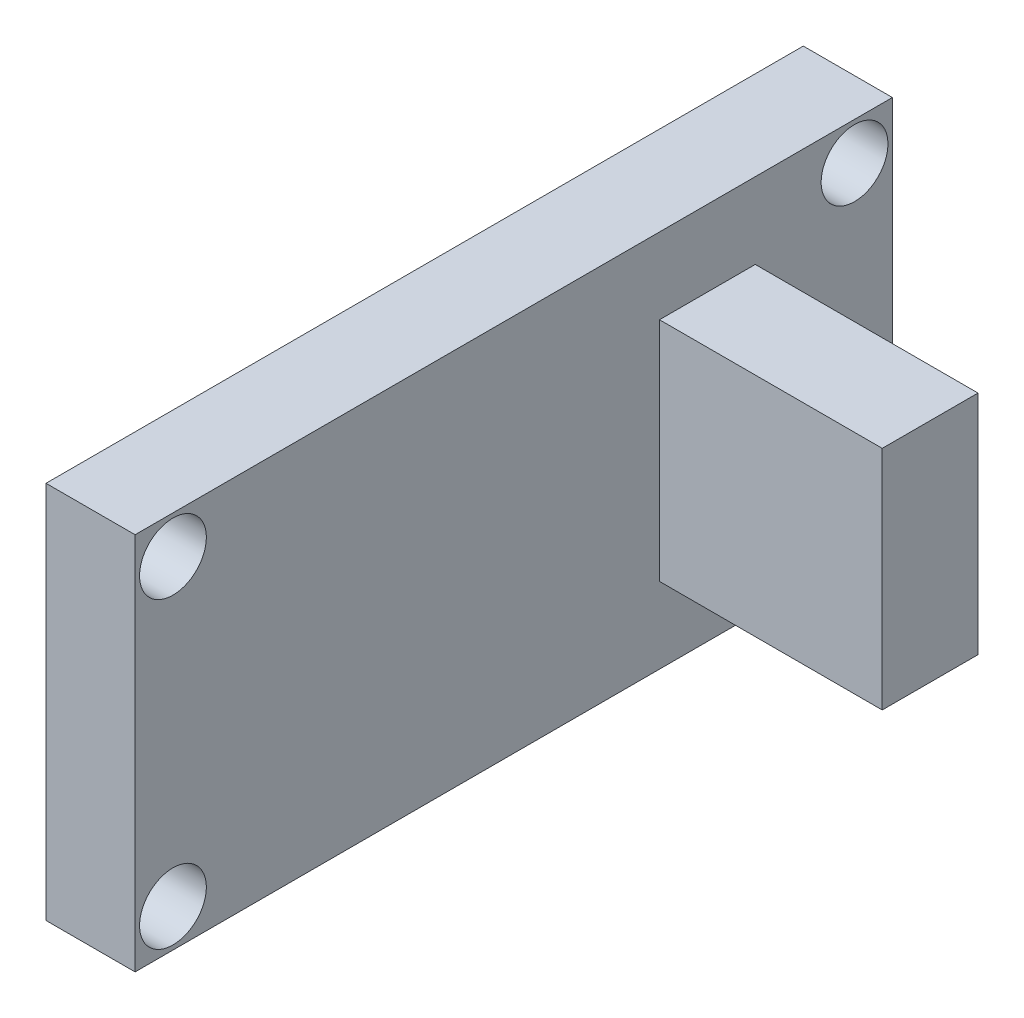
ISO-10303-21;
HEADER;
FILE_DESCRIPTION(('STEP AP214'),'2;1');
FILE_NAME('part.step','',(''),(''),'','','');
FILE_SCHEMA(('AUTOMOTIVE_DESIGN { 1 0 10303 214 1 1 1 1 }'));
ENDSEC;
DATA;
#1=APPLICATION_CONTEXT('core data for automotive mechanical design processes');
#2=APPLICATION_PROTOCOL_DEFINITION('international standard','automotive_design',2000,#1);
#3=PRODUCT_CONTEXT('',#1,'mechanical');
#4=PRODUCT('Part','Part','',(#3));
#5=PRODUCT_RELATED_PRODUCT_CATEGORY('part','',(#4));
#6=PRODUCT_DEFINITION_FORMATION('','',#4);
#7=PRODUCT_DEFINITION_CONTEXT('part definition',#1,'design');
#8=PRODUCT_DEFINITION('design','',#6,#7);
#9=PRODUCT_DEFINITION_SHAPE('','',#8);
#10=(LENGTH_UNIT() NAMED_UNIT(*) SI_UNIT(.MILLI.,.METRE.));
#11=(NAMED_UNIT(*) PLANE_ANGLE_UNIT() SI_UNIT($,.RADIAN.));
#12=(NAMED_UNIT(*) SI_UNIT($,.STERADIAN.) SOLID_ANGLE_UNIT());
#13=UNCERTAINTY_MEASURE_WITH_UNIT(LENGTH_MEASURE(1.E-05),#10,'distance_accuracy_value','');
#14=(GEOMETRIC_REPRESENTATION_CONTEXT(3) GLOBAL_UNCERTAINTY_ASSIGNED_CONTEXT((#13)) GLOBAL_UNIT_ASSIGNED_CONTEXT((#10,
#11,#12)) REPRESENTATION_CONTEXT('',''));
#15=CARTESIAN_POINT('',(0.,0.,0.));
#16=DIRECTION('',(0.,0.,1.));
#17=DIRECTION('',(1.,0.,0.));
#18=AXIS2_PLACEMENT_3D('',#15,#16,#17);
#19=CARTESIAN_POINT('',(4.,0.,0.));
#20=DIRECTION('',(1.,0.,0.));
#21=DIRECTION('',(0.,0.,-1.));
#22=AXIS2_PLACEMENT_3D('',#19,#20,#21);
#23=PLANE('',#22);
#24=CARTESIAN_POINT('',(4.,6.8,-15.3));
#25=DIRECTION('',(1.,0.,0.));
#26=DIRECTION('',(0.,0.,1.));
#27=AXIS2_PLACEMENT_3D('',#24,#25,#26);
#28=CIRCLE('',#27,1.5);
#29=CARTESIAN_POINT('',(4.,6.8,-13.8));
#30=VERTEX_POINT('',#29);
#31=EDGE_CURVE('E151',#30,#30,#28,.T.);
#32=ORIENTED_EDGE('',*,*,#31,.F.);
#33=EDGE_LOOP('',(#32));
#34=FACE_BOUND('',#33,.T.);
#35=CARTESIAN_POINT('',(4.,-6.8,-15.3));
#36=DIRECTION('',(1.,0.,0.));
#37=DIRECTION('',(0.,0.,1.));
#38=AXIS2_PLACEMENT_3D('',#35,#36,#37);
#39=CIRCLE('',#38,1.5);
#40=CARTESIAN_POINT('',(4.,-6.8,-13.8));
#41=VERTEX_POINT('',#40);
#42=EDGE_CURVE('E165',#41,#41,#39,.T.);
#43=ORIENTED_EDGE('',*,*,#42,.F.);
#44=EDGE_LOOP('',(#43));
#45=FACE_BOUND('',#44,.T.);
#46=CARTESIAN_POINT('',(4.,-6.8,15.3));
#47=DIRECTION('',(1.,0.,0.));
#48=DIRECTION('',(0.,0.,-1.));
#49=AXIS2_PLACEMENT_3D('',#46,#47,#48);
#50=CIRCLE('',#49,1.5);
#51=CARTESIAN_POINT('',(4.,-6.8,13.8));
#52=VERTEX_POINT('',#51);
#53=EDGE_CURVE('E156',#52,#52,#50,.T.);
#54=ORIENTED_EDGE('',*,*,#53,.F.);
#55=EDGE_LOOP('',(#54));
#56=FACE_BOUND('',#55,.T.);
#57=CARTESIAN_POINT('',(4.,6.8,15.3));
#58=DIRECTION('',(1.,0.,0.));
#59=DIRECTION('',(0.,0.,-1.));
#60=AXIS2_PLACEMENT_3D('',#57,#58,#59);
#61=CIRCLE('',#60,1.5);
#62=CARTESIAN_POINT('',(4.,6.8,13.8));
#63=VERTEX_POINT('',#62);
#64=EDGE_CURVE('E160',#63,#63,#61,.T.);
#65=ORIENTED_EDGE('',*,*,#64,.F.);
#66=EDGE_LOOP('',(#65));
#67=FACE_BOUND('',#66,.T.);
#68=DIRECTION('',(0.,1.,0.));
#69=VECTOR('',#68,1.);
#70=CARTESIAN_POINT('',(4.,8.5,-17.));
#71=LINE('',#70,#69);
#72=CARTESIAN_POINT('',(4.,-8.5,-17.));
#73=VERTEX_POINT('',#72);
#74=CARTESIAN_POINT('',(4.,8.5,-17.));
#75=VERTEX_POINT('',#74);
#76=EDGE_CURVE('E184',#73,#75,#71,.T.);
#77=ORIENTED_EDGE('',*,*,#76,.T.);
#78=DIRECTION('',(0.,0.,1.));
#79=VECTOR('',#78,1.);
#80=CARTESIAN_POINT('',(4.,8.5,17.));
#81=LINE('',#80,#79);
#82=CARTESIAN_POINT('',(4.,8.5,17.));
#83=VERTEX_POINT('',#82);
#84=EDGE_CURVE('E96',#75,#83,#81,.T.);
#85=ORIENTED_EDGE('',*,*,#84,.T.);
#86=DIRECTION('',(0.,-1.,0.));
#87=VECTOR('',#86,1.);
#88=CARTESIAN_POINT('',(4.,8.5,17.));
#89=LINE('',#88,#87);
#90=CARTESIAN_POINT('',(4.,-8.5,17.));
#91=VERTEX_POINT('',#90);
#92=EDGE_CURVE('E189',#83,#91,#89,.T.);
#93=ORIENTED_EDGE('',*,*,#92,.T.);
#94=DIRECTION('',(0.,0.,-1.));
#95=VECTOR('',#94,1.);
#96=CARTESIAN_POINT('',(4.,-8.5,17.));
#97=LINE('',#96,#95);
#98=EDGE_CURVE('E68',#91,#73,#97,.T.);
#99=ORIENTED_EDGE('',*,*,#98,.T.);
#100=EDGE_LOOP('',(#77,#85,#93,#99));
#101=FACE_BOUND('',#100,.T.);
#102=DIRECTION('',(0.,0.,1.));
#103=VECTOR('',#102,1.);
#104=CARTESIAN_POINT('',(4.,5.08696576525836,-6.5437650887219));
#105=LINE('',#104,#103);
#106=CARTESIAN_POINT('',(4.,5.08696576525836,-10.8435918621979));
#107=VERTEX_POINT('',#106);
#108=CARTESIAN_POINT('',(4.,5.08696576525836,-6.5437650887219));
#109=VERTEX_POINT('',#108);
#110=EDGE_CURVE('E397',#107,#109,#105,.T.);
#111=ORIENTED_EDGE('',*,*,#110,.F.);
#112=DIRECTION('',(0.,1.,0.));
#113=VECTOR('',#112,1.);
#114=CARTESIAN_POINT('',(4.,-5.08696576525836,-10.8435918621979));
#115=LINE('',#114,#113);
#116=CARTESIAN_POINT('',(4.,-5.08696576525836,-10.8435918621979));
#117=VERTEX_POINT('',#116);
#118=EDGE_CURVE('E143',#117,#107,#115,.T.);
#119=ORIENTED_EDGE('',*,*,#118,.F.);
#120=DIRECTION('',(0.,0.,-1.));
#121=VECTOR('',#120,1.);
#122=CARTESIAN_POINT('',(4.,-5.08696576525836,-6.5437650887219));
#123=LINE('',#122,#121);
#124=CARTESIAN_POINT('',(4.,-5.08696576525836,-6.5437650887219));
#125=VERTEX_POINT('',#124);
#126=EDGE_CURVE('E139',#125,#117,#123,.T.);
#127=ORIENTED_EDGE('',*,*,#126,.F.);
#128=DIRECTION('',(0.,-1.,0.));
#129=VECTOR('',#128,1.);
#130=CARTESIAN_POINT('',(4.,-5.08696576525836,-6.5437650887219));
#131=LINE('',#130,#129);
#132=EDGE_CURVE('E393',#109,#125,#131,.T.);
#133=ORIENTED_EDGE('',*,*,#132,.F.);
#134=EDGE_LOOP('',(#111,#119,#127,#133));
#135=FACE_BOUND('',#134,.T.);
#136=ADVANCED_FACE('F43',(#34,#45,#56,#67,#101,#135),#23,.T.);
#137=CARTESIAN_POINT('',(4.,8.5,-17.));
#138=DIRECTION('',(0.,0.,1.));
#139=DIRECTION('',(0.,-1.,0.));
#140=AXIS2_PLACEMENT_3D('',#137,#138,#139);
#141=PLANE('',#140);
#142=DIRECTION('',(0.,1.,0.));
#143=VECTOR('',#142,1.);
#144=CARTESIAN_POINT('',(0.,8.5,-17.));
#145=LINE('',#144,#143);
#146=CARTESIAN_POINT('',(0.,-8.5,-17.));
#147=VERTEX_POINT('',#146);
#148=CARTESIAN_POINT('',(0.,8.5,-17.));
#149=VERTEX_POINT('',#148);
#150=EDGE_CURVE('E180',#147,#149,#145,.T.);
#151=ORIENTED_EDGE('',*,*,#150,.T.);
#152=DIRECTION('',(-1.,0.,0.));
#153=VECTOR('',#152,1.);
#154=CARTESIAN_POINT('',(4.,8.5,-17.));
#155=LINE('',#154,#153);
#156=EDGE_CURVE('E11',#75,#149,#155,.T.);
#157=ORIENTED_EDGE('',*,*,#156,.F.);
#158=ORIENTED_EDGE('',*,*,#76,.F.);
#159=DIRECTION('',(-1.,0.,0.));
#160=VECTOR('',#159,1.);
#161=CARTESIAN_POINT('',(4.,-8.5,-17.));
#162=LINE('',#161,#160);
#163=EDGE_CURVE('E194',#73,#147,#162,.T.);
#164=ORIENTED_EDGE('',*,*,#163,.T.);
#165=EDGE_LOOP('',(#151,#157,#158,#164));
#166=FACE_BOUND('',#165,.T.);
#167=ADVANCED_FACE('F45',(#166),#141,.F.);
#168=CARTESIAN_POINT('',(4.,8.5,17.));
#169=DIRECTION('',(0.,-1.,0.));
#170=DIRECTION('',(0.,0.,-1.));
#171=AXIS2_PLACEMENT_3D('',#168,#169,#170);
#172=PLANE('',#171);
#173=DIRECTION('',(0.,0.,1.));
#174=VECTOR('',#173,1.);
#175=CARTESIAN_POINT('',(0.,8.5,17.));
#176=LINE('',#175,#174);
#177=CARTESIAN_POINT('',(0.,8.5,17.));
#178=VERTEX_POINT('',#177);
#179=EDGE_CURVE('E198',#149,#178,#176,.T.);
#180=ORIENTED_EDGE('',*,*,#179,.T.);
#181=DIRECTION('',(-1.,0.,0.));
#182=VECTOR('',#181,1.);
#183=CARTESIAN_POINT('',(4.,8.5,17.));
#184=LINE('',#183,#182);
#185=EDGE_CURVE('E52',#83,#178,#184,.T.);
#186=ORIENTED_EDGE('',*,*,#185,.F.);
#187=ORIENTED_EDGE('',*,*,#84,.F.);
#188=ORIENTED_EDGE('',*,*,#156,.T.);
#189=EDGE_LOOP('',(#180,#186,#187,#188));
#190=FACE_BOUND('',#189,.T.);
#191=ADVANCED_FACE('F233',(#190),#172,.F.);
#192=CARTESIAN_POINT('',(4.,8.5,17.));
#193=DIRECTION('',(0.,0.,-1.));
#194=DIRECTION('',(0.,1.,0.));
#195=AXIS2_PLACEMENT_3D('',#192,#193,#194);
#196=PLANE('',#195);
#197=DIRECTION('',(0.,-1.,0.));
#198=VECTOR('',#197,1.);
#199=CARTESIAN_POINT('',(0.,8.5,17.));
#200=LINE('',#199,#198);
#201=CARTESIAN_POINT('',(0.,-8.5,17.));
#202=VERTEX_POINT('',#201);
#203=EDGE_CURVE('E201',#178,#202,#200,.T.);
#204=ORIENTED_EDGE('',*,*,#203,.T.);
#205=DIRECTION('',(-1.,0.,0.));
#206=VECTOR('',#205,1.);
#207=CARTESIAN_POINT('',(4.,-8.5,17.));
#208=LINE('',#207,#206);
#209=EDGE_CURVE('E208',#91,#202,#208,.T.);
#210=ORIENTED_EDGE('',*,*,#209,.F.);
#211=ORIENTED_EDGE('',*,*,#92,.F.);
#212=ORIENTED_EDGE('',*,*,#185,.T.);
#213=EDGE_LOOP('',(#204,#210,#211,#212));
#214=FACE_BOUND('',#213,.T.);
#215=ADVANCED_FACE('F215',(#214),#196,.F.);
#216=CARTESIAN_POINT('',(4.,-8.5,17.));
#217=DIRECTION('',(0.,1.,0.));
#218=DIRECTION('',(0.,0.,1.));
#219=AXIS2_PLACEMENT_3D('',#216,#217,#218);
#220=PLANE('',#219);
#221=DIRECTION('',(0.,0.,-1.));
#222=VECTOR('',#221,1.);
#223=CARTESIAN_POINT('',(0.,-8.5,17.));
#224=LINE('',#223,#222);
#225=EDGE_CURVE('E89',#202,#147,#224,.T.);
#226=ORIENTED_EDGE('',*,*,#225,.T.);
#227=ORIENTED_EDGE('',*,*,#163,.F.);
#228=ORIENTED_EDGE('',*,*,#98,.F.);
#229=ORIENTED_EDGE('',*,*,#209,.T.);
#230=EDGE_LOOP('',(#226,#227,#228,#229));
#231=FACE_BOUND('',#230,.T.);
#232=ADVANCED_FACE('F223',(#231),#220,.F.);
#233=CARTESIAN_POINT('',(0.,0.,0.));
#234=DIRECTION('',(1.,0.,0.));
#235=DIRECTION('',(0.,0.,-1.));
#236=AXIS2_PLACEMENT_3D('',#233,#234,#235);
#237=PLANE('',#236);
#238=CARTESIAN_POINT('',(0.,6.8,-15.3));
#239=DIRECTION('',(1.,0.,0.));
#240=DIRECTION('',(0.,0.,1.));
#241=AXIS2_PLACEMENT_3D('',#238,#239,#240);
#242=CIRCLE('',#241,1.5);
#243=CARTESIAN_POINT('',(0.,6.8,-13.8));
#244=VERTEX_POINT('',#243);
#245=EDGE_CURVE('E146',#244,#244,#242,.T.);
#246=ORIENTED_EDGE('',*,*,#245,.T.);
#247=EDGE_LOOP('',(#246));
#248=FACE_BOUND('',#247,.T.);
#249=CARTESIAN_POINT('',(0.,-6.8,-15.3));
#250=DIRECTION('',(1.,0.,0.));
#251=DIRECTION('',(0.,0.,1.));
#252=AXIS2_PLACEMENT_3D('',#249,#250,#251);
#253=CIRCLE('',#252,1.5);
#254=CARTESIAN_POINT('',(0.,-6.8,-13.8));
#255=VERTEX_POINT('',#254);
#256=EDGE_CURVE('E169',#255,#255,#253,.T.);
#257=ORIENTED_EDGE('',*,*,#256,.T.);
#258=EDGE_LOOP('',(#257));
#259=FACE_BOUND('',#258,.T.);
#260=CARTESIAN_POINT('',(0.,-6.8,15.3));
#261=DIRECTION('',(1.,0.,0.));
#262=DIRECTION('',(0.,0.,-1.));
#263=AXIS2_PLACEMENT_3D('',#260,#261,#262);
#264=CIRCLE('',#263,1.5);
#265=CARTESIAN_POINT('',(0.,-6.8,13.8));
#266=VERTEX_POINT('',#265);
#267=EDGE_CURVE('E161',#266,#266,#264,.T.);
#268=ORIENTED_EDGE('',*,*,#267,.T.);
#269=EDGE_LOOP('',(#268));
#270=FACE_BOUND('',#269,.T.);
#271=CARTESIAN_POINT('',(0.,6.8,15.3));
#272=DIRECTION('',(1.,0.,0.));
#273=DIRECTION('',(0.,0.,-1.));
#274=AXIS2_PLACEMENT_3D('',#271,#272,#273);
#275=CIRCLE('',#274,1.5);
#276=CARTESIAN_POINT('',(0.,6.8,13.8));
#277=VERTEX_POINT('',#276);
#278=EDGE_CURVE('E176',#277,#277,#275,.T.);
#279=ORIENTED_EDGE('',*,*,#278,.T.);
#280=EDGE_LOOP('',(#279));
#281=FACE_BOUND('',#280,.T.);
#282=ORIENTED_EDGE('',*,*,#150,.F.);
#283=ORIENTED_EDGE('',*,*,#225,.F.);
#284=ORIENTED_EDGE('',*,*,#203,.F.);
#285=ORIENTED_EDGE('',*,*,#179,.F.);
#286=EDGE_LOOP('',(#282,#283,#284,#285));
#287=FACE_BOUND('',#286,.T.);
#288=ADVANCED_FACE('F219',(#248,#259,#270,#281,#287),#237,.F.);
#289=CARTESIAN_POINT('',(0.,6.8,15.3));
#290=DIRECTION('',(1.,0.,0.));
#291=DIRECTION('',(0.,0.,-1.));
#292=AXIS2_PLACEMENT_3D('',#289,#290,#291);
#293=CYLINDRICAL_SURFACE('',#292,1.5);
#294=ORIENTED_EDGE('',*,*,#278,.F.);
#295=EDGE_LOOP('',(#294));
#296=FACE_BOUND('',#295,.T.);
#297=ORIENTED_EDGE('',*,*,#64,.T.);
#298=EDGE_LOOP('',(#297));
#299=FACE_BOUND('',#298,.T.);
#300=ADVANCED_FACE('F230',(#296,#299),#293,.F.);
#301=CARTESIAN_POINT('',(0.,-6.8,15.3));
#302=DIRECTION('',(1.,0.,0.));
#303=DIRECTION('',(0.,0.,-1.));
#304=AXIS2_PLACEMENT_3D('',#301,#302,#303);
#305=CYLINDRICAL_SURFACE('',#304,1.5);
#306=ORIENTED_EDGE('',*,*,#267,.F.);
#307=EDGE_LOOP('',(#306));
#308=FACE_BOUND('',#307,.T.);
#309=ORIENTED_EDGE('',*,*,#53,.T.);
#310=EDGE_LOOP('',(#309));
#311=FACE_BOUND('',#310,.T.);
#312=ADVANCED_FACE('F246',(#308,#311),#305,.F.);
#313=CARTESIAN_POINT('',(0.,-6.8,-15.3));
#314=DIRECTION('',(1.,0.,0.));
#315=DIRECTION('',(0.,0.,-1.));
#316=AXIS2_PLACEMENT_3D('',#313,#314,#315);
#317=CYLINDRICAL_SURFACE('',#316,1.5);
#318=ORIENTED_EDGE('',*,*,#256,.F.);
#319=EDGE_LOOP('',(#318));
#320=FACE_BOUND('',#319,.T.);
#321=ORIENTED_EDGE('',*,*,#42,.T.);
#322=EDGE_LOOP('',(#321));
#323=FACE_BOUND('',#322,.T.);
#324=ADVANCED_FACE('F251',(#320,#323),#317,.F.);
#325=CARTESIAN_POINT('',(0.,6.8,-15.3));
#326=DIRECTION('',(1.,0.,0.));
#327=DIRECTION('',(0.,0.,-1.));
#328=AXIS2_PLACEMENT_3D('',#325,#326,#327);
#329=CYLINDRICAL_SURFACE('',#328,1.5);
#330=ORIENTED_EDGE('',*,*,#245,.F.);
#331=EDGE_LOOP('',(#330));
#332=FACE_BOUND('',#331,.T.);
#333=ORIENTED_EDGE('',*,*,#31,.T.);
#334=EDGE_LOOP('',(#333));
#335=FACE_BOUND('',#334,.T.);
#336=ADVANCED_FACE('F248',(#332,#335),#329,.F.);
#337=CARTESIAN_POINT('',(14.,-5.08696576525836,-10.8435918621979));
#338=DIRECTION('',(0.,0.,1.));
#339=DIRECTION('',(1.,0.,0.));
#340=AXIS2_PLACEMENT_3D('',#337,#338,#339);
#341=PLANE('',#340);
#342=ORIENTED_EDGE('',*,*,#118,.T.);
#343=DIRECTION('',(-1.,0.,0.));
#344=VECTOR('',#343,1.);
#345=CARTESIAN_POINT('',(14.,5.08696576525836,-10.8435918621979));
#346=LINE('',#345,#344);
#347=CARTESIAN_POINT('',(14.,5.08696576525836,-10.8435918621979));
#348=VERTEX_POINT('',#347);
#349=EDGE_CURVE('E122',#348,#107,#346,.T.);
#350=ORIENTED_EDGE('',*,*,#349,.F.);
#351=DIRECTION('',(0.,1.,0.));
#352=VECTOR('',#351,1.);
#353=CARTESIAN_POINT('',(14.,-5.08696576525836,-10.8435918621979));
#354=LINE('',#353,#352);
#355=CARTESIAN_POINT('',(14.,-5.08696576525836,-10.8435918621979));
#356=VERTEX_POINT('',#355);
#357=EDGE_CURVE('E130',#356,#348,#354,.T.);
#358=ORIENTED_EDGE('',*,*,#357,.F.);
#359=DIRECTION('',(-1.,0.,0.));
#360=VECTOR('',#359,1.);
#361=CARTESIAN_POINT('',(14.,-5.08696576525836,-10.8435918621979));
#362=LINE('',#361,#360);
#363=EDGE_CURVE('E389',#356,#117,#362,.T.);
#364=ORIENTED_EDGE('',*,*,#363,.T.);
#365=EDGE_LOOP('',(#342,#350,#358,#364));
#366=FACE_BOUND('',#365,.T.);
#367=ADVANCED_FACE('F141',(#366),#341,.F.);
#368=CARTESIAN_POINT('',(14.,5.08696576525836,-6.5437650887219));
#369=DIRECTION('',(0.,-1.,0.));
#370=DIRECTION('',(0.,0.,-1.));
#371=AXIS2_PLACEMENT_3D('',#368,#369,#370);
#372=PLANE('',#371);
#373=ORIENTED_EDGE('',*,*,#110,.T.);
#374=DIRECTION('',(-1.,0.,0.));
#375=VECTOR('',#374,1.);
#376=CARTESIAN_POINT('',(14.,5.08696576525836,-6.5437650887219));
#377=LINE('',#376,#375);
#378=CARTESIAN_POINT('',(14.,5.08696576525836,-6.5437650887219));
#379=VERTEX_POINT('',#378);
#380=EDGE_CURVE('E125',#379,#109,#377,.T.);
#381=ORIENTED_EDGE('',*,*,#380,.F.);
#382=DIRECTION('',(0.,0.,1.));
#383=VECTOR('',#382,1.);
#384=CARTESIAN_POINT('',(14.,5.08696576525836,-6.5437650887219));
#385=LINE('',#384,#383);
#386=EDGE_CURVE('E118',#348,#379,#385,.T.);
#387=ORIENTED_EDGE('',*,*,#386,.F.);
#388=ORIENTED_EDGE('',*,*,#349,.T.);
#389=EDGE_LOOP('',(#373,#381,#387,#388));
#390=FACE_BOUND('',#389,.T.);
#391=ADVANCED_FACE('F120',(#390),#372,.F.);
#392=CARTESIAN_POINT('',(14.,-5.08696576525836,-6.5437650887219));
#393=DIRECTION('',(0.,0.,-1.));
#394=DIRECTION('',(-1.,0.,0.));
#395=AXIS2_PLACEMENT_3D('',#392,#393,#394);
#396=PLANE('',#395);
#397=ORIENTED_EDGE('',*,*,#132,.T.);
#398=DIRECTION('',(-1.,0.,0.));
#399=VECTOR('',#398,1.);
#400=CARTESIAN_POINT('',(14.,-5.08696576525836,-6.5437650887219));
#401=LINE('',#400,#399);
#402=CARTESIAN_POINT('',(14.,-5.08696576525836,-6.5437650887219));
#403=VERTEX_POINT('',#402);
#404=EDGE_CURVE('E59',#403,#125,#401,.T.);
#405=ORIENTED_EDGE('',*,*,#404,.F.);
#406=DIRECTION('',(0.,-1.,0.));
#407=VECTOR('',#406,1.);
#408=CARTESIAN_POINT('',(14.,-5.08696576525836,-6.5437650887219));
#409=LINE('',#408,#407);
#410=EDGE_CURVE('E129',#379,#403,#409,.T.);
#411=ORIENTED_EDGE('',*,*,#410,.F.);
#412=ORIENTED_EDGE('',*,*,#380,.T.);
#413=EDGE_LOOP('',(#397,#405,#411,#412));
#414=FACE_BOUND('',#413,.T.);
#415=ADVANCED_FACE('F263',(#414),#396,.F.);
#416=CARTESIAN_POINT('',(14.,-5.08696576525836,-6.5437650887219));
#417=DIRECTION('',(0.,1.,0.));
#418=DIRECTION('',(0.,0.,1.));
#419=AXIS2_PLACEMENT_3D('',#416,#417,#418);
#420=PLANE('',#419);
#421=ORIENTED_EDGE('',*,*,#126,.T.);
#422=ORIENTED_EDGE('',*,*,#363,.F.);
#423=DIRECTION('',(0.,0.,-1.));
#424=VECTOR('',#423,1.);
#425=CARTESIAN_POINT('',(14.,-5.08696576525836,-6.5437650887219));
#426=LINE('',#425,#424);
#427=EDGE_CURVE('E134',#403,#356,#426,.T.);
#428=ORIENTED_EDGE('',*,*,#427,.F.);
#429=ORIENTED_EDGE('',*,*,#404,.T.);
#430=EDGE_LOOP('',(#421,#422,#428,#429));
#431=FACE_BOUND('',#430,.T.);
#432=ADVANCED_FACE('F266',(#431),#420,.F.);
#433=CARTESIAN_POINT('',(14.,0.,0.));
#434=DIRECTION('',(-1.,0.,0.));
#435=DIRECTION('',(0.,0.,1.));
#436=AXIS2_PLACEMENT_3D('',#433,#434,#435);
#437=PLANE('',#436);
#438=ORIENTED_EDGE('',*,*,#357,.T.);
#439=ORIENTED_EDGE('',*,*,#386,.T.);
#440=ORIENTED_EDGE('',*,*,#410,.T.);
#441=ORIENTED_EDGE('',*,*,#427,.T.);
#442=EDGE_LOOP('',(#438,#439,#440,#441));
#443=FACE_BOUND('',#442,.T.);
#444=ADVANCED_FACE('F133',(#443),#437,.F.);
#445=CLOSED_SHELL('',(#136,#167,#191,#215,#232,#288,#300,#312,#324,#336,#367,#391,#415,#432,#444));
#446=MANIFOLD_SOLID_BREP('B2',#445);
#447=ADVANCED_BREP_SHAPE_REPRESENTATION('',(#18,#446),#14);
#448=SHAPE_DEFINITION_REPRESENTATION(#9,#447);
ENDSEC;
END-ISO-10303-21;
